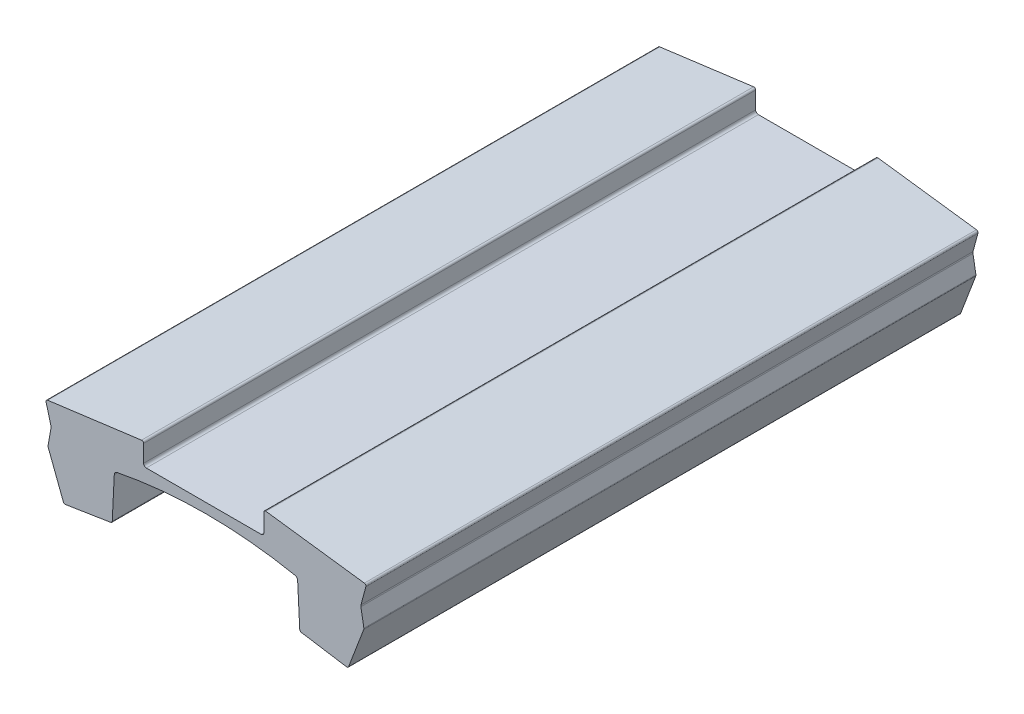
ISO-10303-21;
HEADER;
FILE_DESCRIPTION(('STEP AP214'),'2;1');
FILE_NAME('part.step','',(''),(''),'','','');
FILE_SCHEMA(('AUTOMOTIVE_DESIGN { 1 0 10303 214 1 1 1 1 }'));
ENDSEC;
DATA;
#1=APPLICATION_CONTEXT('core data for automotive mechanical design processes');
#2=APPLICATION_PROTOCOL_DEFINITION('international standard','automotive_design',2000,#1);
#3=PRODUCT_CONTEXT('',#1,'mechanical');
#4=PRODUCT('Part','Part','',(#3));
#5=PRODUCT_RELATED_PRODUCT_CATEGORY('part','',(#4));
#6=PRODUCT_DEFINITION_FORMATION('','',#4);
#7=PRODUCT_DEFINITION_CONTEXT('part definition',#1,'design');
#8=PRODUCT_DEFINITION('design','',#6,#7);
#9=PRODUCT_DEFINITION_SHAPE('','',#8);
#10=(LENGTH_UNIT() NAMED_UNIT(*) SI_UNIT(.MILLI.,.METRE.));
#11=(NAMED_UNIT(*) PLANE_ANGLE_UNIT() SI_UNIT($,.RADIAN.));
#12=(NAMED_UNIT(*) SI_UNIT($,.STERADIAN.) SOLID_ANGLE_UNIT());
#13=UNCERTAINTY_MEASURE_WITH_UNIT(LENGTH_MEASURE(1.E-05),#10,'distance_accuracy_value','');
#14=(GEOMETRIC_REPRESENTATION_CONTEXT(3) GLOBAL_UNCERTAINTY_ASSIGNED_CONTEXT((#13)) GLOBAL_UNIT_ASSIGNED_CONTEXT((#10,
#11,#12)) REPRESENTATION_CONTEXT('',''));
#15=CARTESIAN_POINT('',(0.,0.,0.));
#16=DIRECTION('',(0.,0.,1.));
#17=DIRECTION('',(1.,0.,0.));
#18=AXIS2_PLACEMENT_3D('',#15,#16,#17);
#19=CARTESIAN_POINT('',(-17.4316539331724,90.6078613463852,67.5));
#20=DIRECTION('',(0.,0.,-1.));
#21=DIRECTION('',(-1.,0.,0.));
#22=AXIS2_PLACEMENT_3D('',#19,#20,#21);
#23=CYLINDRICAL_SURFACE('',#22,0.200000000000002);
#24=CARTESIAN_POINT('',(-17.4316539331724,90.6078613463852,0.));
#25=DIRECTION('',(0.,0.,1.));
#26=DIRECTION('',(1.,0.,0.));
#27=AXIS2_PLACEMENT_3D('',#24,#25,#26);
#28=CIRCLE('',#27,0.200000000000002);
#29=CARTESIAN_POINT('',(-17.4577591716164,90.8061503186599,0.));
#30=VERTEX_POINT('',#29);
#31=CARTESIAN_POINT('',(-17.6248390984302,90.5560975373647,0.));
#32=VERTEX_POINT('',#31);
#33=EDGE_CURVE('E288',#30,#32,#28,.T.);
#34=ORIENTED_EDGE('',*,*,#33,.T.);
#35=DIRECTION('',(0.,0.,-1.));
#36=VECTOR('',#35,1.);
#37=CARTESIAN_POINT('',(-17.6248390984302,90.5560975373647,67.5));
#38=LINE('',#37,#36);
#39=CARTESIAN_POINT('',(-17.6248390984302,90.5560975373647,67.5));
#40=VERTEX_POINT('',#39);
#41=EDGE_CURVE('E11',#40,#32,#38,.T.);
#42=ORIENTED_EDGE('',*,*,#41,.F.);
#43=CARTESIAN_POINT('',(-17.4316539331724,90.6078613463852,67.5));
#44=DIRECTION('',(0.,0.,1.));
#45=DIRECTION('',(1.,0.,0.));
#46=AXIS2_PLACEMENT_3D('',#43,#44,#45);
#47=CIRCLE('',#46,0.200000000000002);
#48=CARTESIAN_POINT('',(-17.4577591716164,90.8061503186599,67.5));
#49=VERTEX_POINT('',#48);
#50=EDGE_CURVE('E406',#49,#40,#47,.T.);
#51=ORIENTED_EDGE('',*,*,#50,.F.);
#52=DIRECTION('',(0.,0.,-1.));
#53=VECTOR('',#52,1.);
#54=CARTESIAN_POINT('',(-17.4577591716164,90.8061503186599,67.5));
#55=LINE('',#54,#53);
#56=EDGE_CURVE('E56',#49,#30,#55,.T.);
#57=ORIENTED_EDGE('',*,*,#56,.T.);
#58=EDGE_LOOP('',(#34,#42,#51,#57));
#59=FACE_BOUND('',#58,.T.);
#60=ADVANCED_FACE('F39',(#59),#23,.T.);
#61=CARTESIAN_POINT('',(-17.6248390984302,90.5560975373647,67.5));
#62=DIRECTION('',(0.965925826289071,0.258819045102509,0.));
#63=DIRECTION('',(-0.258819045102509,0.965925826289071,0.));
#64=AXIS2_PLACEMENT_3D('',#61,#62,#63);
#65=PLANE('',#64);
#66=DIRECTION('',(0.258819045102509,-0.965925826289071,0.));
#67=VECTOR('',#66,1.);
#68=CARTESIAN_POINT('',(-17.6248390984302,90.5560975373647,0.));
#69=LINE('',#68,#67);
#70=CARTESIAN_POINT('',(-17.0819649438388,88.5300636103135,0.));
#71=VERTEX_POINT('',#70);
#72=EDGE_CURVE('E291',#32,#71,#69,.T.);
#73=ORIENTED_EDGE('',*,*,#72,.T.);
#74=DIRECTION('',(0.,0.,-1.));
#75=VECTOR('',#74,1.);
#76=CARTESIAN_POINT('',(-17.0819649438388,88.5300636103135,67.5));
#77=LINE('',#76,#75);
#78=CARTESIAN_POINT('',(-17.0819649438388,88.5300636103135,67.5));
#79=VERTEX_POINT('',#78);
#80=EDGE_CURVE('E48',#79,#71,#77,.T.);
#81=ORIENTED_EDGE('',*,*,#80,.F.);
#82=DIRECTION('',(0.258819045102509,-0.965925826289071,0.));
#83=VECTOR('',#82,1.);
#84=CARTESIAN_POINT('',(-17.6248390984302,90.5560975373647,67.5));
#85=LINE('',#84,#83);
#86=EDGE_CURVE('E167',#40,#79,#85,.T.);
#87=ORIENTED_EDGE('',*,*,#86,.F.);
#88=ORIENTED_EDGE('',*,*,#41,.T.);
#89=EDGE_LOOP('',(#73,#81,#87,#88));
#90=FACE_BOUND('',#89,.T.);
#91=ADVANCED_FACE('F626',(#90),#65,.F.);
#92=CARTESIAN_POINT('',(-17.4683352743544,88.4265359922725,67.5));
#93=DIRECTION('',(0.,0.,-1.));
#94=DIRECTION('',(-1.,0.,0.));
#95=AXIS2_PLACEMENT_3D('',#92,#93,#94);
#96=CYLINDRICAL_SURFACE('',#95,0.400000000000002);
#97=CARTESIAN_POINT('',(-17.4683352743544,88.4265359922725,0.));
#98=DIRECTION('',(0.,0.,-1.));
#99=DIRECTION('',(-1.,0.,0.));
#100=AXIS2_PLACEMENT_3D('',#97,#98,#99);
#101=CIRCLE('',#100,0.400000000000002);
#102=CARTESIAN_POINT('',(-17.0743440800539,88.357464009431,0.));
#103=VERTEX_POINT('',#102);
#104=EDGE_CURVE('E294',#71,#103,#101,.T.);
#105=ORIENTED_EDGE('',*,*,#104,.T.);
#106=DIRECTION('',(0.,0.,-1.));
#107=VECTOR('',#106,1.);
#108=CARTESIAN_POINT('',(-17.0743440800539,88.357464009431,67.5));
#109=LINE('',#108,#107);
#110=CARTESIAN_POINT('',(-17.0743440800539,88.357464009431,67.5));
#111=VERTEX_POINT('',#110);
#112=EDGE_CURVE('E493',#111,#103,#109,.T.);
#113=ORIENTED_EDGE('',*,*,#112,.F.);
#114=CARTESIAN_POINT('',(-17.4683352743544,88.4265359922725,67.5));
#115=DIRECTION('',(0.,0.,-1.));
#116=DIRECTION('',(-1.,0.,0.));
#117=AXIS2_PLACEMENT_3D('',#114,#115,#116);
#118=CIRCLE('',#117,0.400000000000002);
#119=EDGE_CURVE('E502',#79,#111,#118,.T.);
#120=ORIENTED_EDGE('',*,*,#119,.F.);
#121=ORIENTED_EDGE('',*,*,#80,.T.);
#122=EDGE_LOOP('',(#105,#113,#120,#121));
#123=FACE_BOUND('',#122,.T.);
#124=ADVANCED_FACE('F500',(#123),#96,.F.);
#125=CARTESIAN_POINT('',(-17.4061010087792,86.4651003738614,67.5));
#126=DIRECTION('',(-0.984977985751272,0.172679957103789,0.));
#127=DIRECTION('',(-0.172679957103789,-0.984977985751272,0.));
#128=AXIS2_PLACEMENT_3D('',#125,#126,#127);
#129=PLANE('',#128);
#130=DIRECTION('',(0.172679957103789,0.984977985751272,0.));
#131=VECTOR('',#130,1.);
#132=CARTESIAN_POINT('',(-17.4061010087792,86.4651003738614,0.));
#133=LINE('',#132,#131);
#134=CARTESIAN_POINT('',(-17.4061010087792,86.4651003738614,0.));
#135=VERTEX_POINT('',#134);
#136=EDGE_CURVE('E298',#135,#103,#133,.T.);
#137=ORIENTED_EDGE('',*,*,#136,.F.);
#138=DIRECTION('',(0.,0.,-1.));
#139=VECTOR('',#138,1.);
#140=CARTESIAN_POINT('',(-17.4061010087792,86.4651003738614,67.5));
#141=LINE('',#140,#139);
#142=CARTESIAN_POINT('',(-17.4061010087792,86.4651003738614,67.5));
#143=VERTEX_POINT('',#142);
#144=EDGE_CURVE('E490',#143,#135,#141,.T.);
#145=ORIENTED_EDGE('',*,*,#144,.F.);
#146=DIRECTION('',(0.172679957103789,0.984977985751272,0.));
#147=VECTOR('',#146,1.);
#148=CARTESIAN_POINT('',(-17.4061010087792,86.4651003738614,67.5));
#149=LINE('',#148,#147);
#150=EDGE_CURVE('E512',#143,#111,#149,.T.);
#151=ORIENTED_EDGE('',*,*,#150,.T.);
#152=ORIENTED_EDGE('',*,*,#112,.T.);
#153=EDGE_LOOP('',(#137,#145,#151,#152));
#154=FACE_BOUND('',#153,.T.);
#155=ADVANCED_FACE('F509',(#154),#129,.T.);
#156=CARTESIAN_POINT('',(-17.209105411629,86.4305643824407,67.5));
#157=DIRECTION('',(0.,0.,-1.));
#158=DIRECTION('',(-1.,0.,0.));
#159=AXIS2_PLACEMENT_3D('',#156,#157,#158);
#160=CYLINDRICAL_SURFACE('',#159,0.200000000000001);
#161=CARTESIAN_POINT('',(-17.209105411629,86.4305643824407,0.));
#162=DIRECTION('',(0.,0.,-1.));
#163=DIRECTION('',(-1.,0.,0.));
#164=AXIS2_PLACEMENT_3D('',#161,#162,#163);
#165=CIRCLE('',#164,0.200000000000001);
#166=CARTESIAN_POINT('',(-17.3959624943184,86.3592591887393,0.));
#167=VERTEX_POINT('',#166);
#168=EDGE_CURVE('E302',#167,#135,#165,.T.);
#169=ORIENTED_EDGE('',*,*,#168,.F.);
#170=DIRECTION('',(0.,0.,-1.));
#171=VECTOR('',#170,1.);
#172=CARTESIAN_POINT('',(-17.3959624943184,86.3592591887393,67.5));
#173=LINE('',#172,#171);
#174=CARTESIAN_POINT('',(-17.3959624943184,86.3592591887393,67.5));
#175=VERTEX_POINT('',#174);
#176=EDGE_CURVE('E487',#175,#167,#173,.T.);
#177=ORIENTED_EDGE('',*,*,#176,.F.);
#178=CARTESIAN_POINT('',(-17.209105411629,86.4305643824407,67.5));
#179=DIRECTION('',(0.,0.,-1.));
#180=DIRECTION('',(-1.,0.,0.));
#181=AXIS2_PLACEMENT_3D('',#178,#179,#180);
#182=CIRCLE('',#181,0.200000000000001);
#183=EDGE_CURVE('E516',#175,#143,#182,.T.);
#184=ORIENTED_EDGE('',*,*,#183,.T.);
#185=ORIENTED_EDGE('',*,*,#144,.T.);
#186=EDGE_LOOP('',(#169,#177,#184,#185));
#187=FACE_BOUND('',#186,.T.);
#188=ADVANCED_FACE('F892',(#187),#160,.T.);
#189=CARTESIAN_POINT('',(-17.3959624943184,86.3592591887393,67.5));
#190=DIRECTION('',(0.934285413447254,0.356525968506776,0.));
#191=DIRECTION('',(-0.356525968506776,0.934285413447254,0.));
#192=AXIS2_PLACEMENT_3D('',#189,#190,#191);
#193=PLANE('',#192);
#194=DIRECTION('',(0.356525968506776,-0.934285413447254,0.));
#195=VECTOR('',#194,1.);
#196=CARTESIAN_POINT('',(-17.3959624943184,86.3592591887393,0.));
#197=LINE('',#196,#195);
#198=CARTESIAN_POINT('',(-15.7145600064224,81.9531009917514,0.));
#199=VERTEX_POINT('',#198);
#200=EDGE_CURVE('E306',#167,#199,#197,.T.);
#201=ORIENTED_EDGE('',*,*,#200,.T.);
#202=DIRECTION('',(0.,0.,-1.));
#203=VECTOR('',#202,1.);
#204=CARTESIAN_POINT('',(-15.7145600064224,81.9531009917514,67.5));
#205=LINE('',#204,#203);
#206=CARTESIAN_POINT('',(-15.7145600064224,81.9531009917514,67.5));
#207=VERTEX_POINT('',#206);
#208=EDGE_CURVE('E483',#207,#199,#205,.T.);
#209=ORIENTED_EDGE('',*,*,#208,.F.);
#210=DIRECTION('',(0.356525968506776,-0.934285413447254,0.));
#211=VECTOR('',#210,1.);
#212=CARTESIAN_POINT('',(-17.3959624943184,86.3592591887393,67.5));
#213=LINE('',#212,#211);
#214=EDGE_CURVE('E520',#175,#207,#213,.T.);
#215=ORIENTED_EDGE('',*,*,#214,.F.);
#216=ORIENTED_EDGE('',*,*,#176,.T.);
#217=EDGE_LOOP('',(#201,#209,#215,#216));
#218=FACE_BOUND('',#217,.T.);
#219=ADVANCED_FACE('F882',(#218),#193,.F.);
#220=CARTESIAN_POINT('',(-15.527702923733,82.0244061854528,67.5));
#221=DIRECTION('',(0.,0.,-1.));
#222=DIRECTION('',(-1.,0.,0.));
#223=AXIS2_PLACEMENT_3D('',#220,#221,#222);
#224=CYLINDRICAL_SURFACE('',#223,0.200000000000001);
#225=CARTESIAN_POINT('',(-15.527702923733,82.0244061854528,0.));
#226=DIRECTION('',(0.,0.,1.));
#227=DIRECTION('',(1.,0.,0.));
#228=AXIS2_PLACEMENT_3D('',#225,#226,#227);
#229=CIRCLE('',#228,0.200000000000001);
#230=CARTESIAN_POINT('',(-15.4964160307249,81.8268685173337,0.));
#231=VERTEX_POINT('',#230);
#232=EDGE_CURVE('E309',#199,#231,#229,.T.);
#233=ORIENTED_EDGE('',*,*,#232,.T.);
#234=DIRECTION('',(0.,0.,-1.));
#235=VECTOR('',#234,1.);
#236=CARTESIAN_POINT('',(-15.4964160307249,81.8268685173337,67.5));
#237=LINE('',#236,#235);
#238=CARTESIAN_POINT('',(-15.4964160307249,81.8268685173337,67.5));
#239=VERTEX_POINT('',#238);
#240=EDGE_CURVE('E479',#239,#231,#237,.T.);
#241=ORIENTED_EDGE('',*,*,#240,.F.);
#242=CARTESIAN_POINT('',(-15.527702923733,82.0244061854528,67.5));
#243=DIRECTION('',(0.,0.,1.));
#244=DIRECTION('',(1.,0.,0.));
#245=AXIS2_PLACEMENT_3D('',#242,#243,#244);
#246=CIRCLE('',#245,0.200000000000001);
#247=EDGE_CURVE('E527',#207,#239,#246,.T.);
#248=ORIENTED_EDGE('',*,*,#247,.F.);
#249=ORIENTED_EDGE('',*,*,#208,.T.);
#250=EDGE_LOOP('',(#233,#241,#248,#249));
#251=FACE_BOUND('',#250,.T.);
#252=ADVANCED_FACE('F872',(#251),#224,.T.);
#253=CARTESIAN_POINT('',(-15.4964160307249,81.8268685173337,67.5));
#254=DIRECTION('',(-0.156434465040214,0.98768834059514,0.));
#255=DIRECTION('',(-0.98768834059514,-0.156434465040214,0.));
#256=AXIS2_PLACEMENT_3D('',#253,#254,#255);
#257=PLANE('',#256);
#258=DIRECTION('',(0.98768834059514,0.156434465040214,0.));
#259=VECTOR('',#258,1.);
#260=CARTESIAN_POINT('',(-15.4964160307249,81.8268685173337,0.));
#261=LINE('',#260,#259);
#262=CARTESIAN_POINT('',(-10.4958388076464,82.6188821421106,0.));
#263=VERTEX_POINT('',#262);
#264=EDGE_CURVE('E312',#231,#263,#261,.T.);
#265=ORIENTED_EDGE('',*,*,#264,.T.);
#266=DIRECTION('',(0.,0.,-1.));
#267=VECTOR('',#266,1.);
#268=CARTESIAN_POINT('',(-10.4958388076464,82.6188821421106,67.5));
#269=LINE('',#268,#267);
#270=CARTESIAN_POINT('',(-10.4958388076464,82.6188821421106,67.5));
#271=VERTEX_POINT('',#270);
#272=EDGE_CURVE('E475',#271,#263,#269,.T.);
#273=ORIENTED_EDGE('',*,*,#272,.F.);
#274=DIRECTION('',(0.98768834059514,0.156434465040214,0.));
#275=VECTOR('',#274,1.);
#276=CARTESIAN_POINT('',(-15.4964160307249,81.8268685173337,67.5));
#277=LINE('',#276,#275);
#278=EDGE_CURVE('E530',#239,#271,#277,.T.);
#279=ORIENTED_EDGE('',*,*,#278,.F.);
#280=ORIENTED_EDGE('',*,*,#240,.T.);
#281=EDGE_LOOP('',(#265,#273,#279,#280));
#282=FACE_BOUND('',#281,.T.);
#283=ADVANCED_FACE('F862',(#282),#257,.F.);
#284=CARTESIAN_POINT('',(-10.5271257006544,82.8164198102296,67.5));
#285=DIRECTION('',(0.,0.,-1.));
#286=DIRECTION('',(-1.,0.,0.));
#287=AXIS2_PLACEMENT_3D('',#284,#285,#286);
#288=CYLINDRICAL_SURFACE('',#287,0.200000000000001);
#289=CARTESIAN_POINT('',(-10.5271257006544,82.8164198102296,0.));
#290=DIRECTION('',(0.,0.,1.));
#291=DIRECTION('',(1.,0.,0.));
#292=AXIS2_PLACEMENT_3D('',#289,#290,#291);
#293=CIRCLE('',#292,0.200000000000001);
#294=CARTESIAN_POINT('',(-10.3273699530985,82.8065384480582,0.));
#295=VERTEX_POINT('',#294);
#296=EDGE_CURVE('E315',#263,#295,#293,.T.);
#297=ORIENTED_EDGE('',*,*,#296,.T.);
#298=DIRECTION('',(0.,0.,-1.));
#299=VECTOR('',#298,1.);
#300=CARTESIAN_POINT('',(-10.3273699530985,82.8065384480582,67.5));
#301=LINE('',#300,#299);
#302=CARTESIAN_POINT('',(-10.3273699530985,82.8065384480582,67.5));
#303=VERTEX_POINT('',#302);
#304=EDGE_CURVE('E471',#303,#295,#301,.T.);
#305=ORIENTED_EDGE('',*,*,#304,.F.);
#306=CARTESIAN_POINT('',(-10.5271257006544,82.8164198102296,67.5));
#307=DIRECTION('',(0.,0.,1.));
#308=DIRECTION('',(1.,0.,0.));
#309=AXIS2_PLACEMENT_3D('',#306,#307,#308);
#310=CIRCLE('',#309,0.200000000000001);
#311=EDGE_CURVE('E533',#271,#303,#310,.T.);
#312=ORIENTED_EDGE('',*,*,#311,.F.);
#313=ORIENTED_EDGE('',*,*,#272,.T.);
#314=EDGE_LOOP('',(#297,#305,#312,#313));
#315=FACE_BOUND('',#314,.T.);
#316=ADVANCED_FACE('F852',(#315),#288,.T.);
#317=CARTESIAN_POINT('',(-10.3273699530985,82.8065384480582,67.5));
#318=DIRECTION('',(-0.998778737779756,0.0494068108571876,0.));
#319=DIRECTION('',(-0.0494068108571876,-0.998778737779756,0.));
#320=AXIS2_PLACEMENT_3D('',#317,#318,#319);
#321=PLANE('',#320);
#322=DIRECTION('',(0.0494068108571876,0.998778737779756,0.));
#323=VECTOR('',#322,1.);
#324=CARTESIAN_POINT('',(-10.3273699530985,82.8065384480582,0.));
#325=LINE('',#324,#323);
#326=CARTESIAN_POINT('',(-10.1018941682697,87.3646229684729,0.));
#327=VERTEX_POINT('',#326);
#328=EDGE_CURVE('E318',#295,#327,#325,.T.);
#329=ORIENTED_EDGE('',*,*,#328,.T.);
#330=DIRECTION('',(0.,0.,-1.));
#331=VECTOR('',#330,1.);
#332=CARTESIAN_POINT('',(-10.1018941682697,87.3646229684729,67.5));
#333=LINE('',#332,#331);
#334=CARTESIAN_POINT('',(-10.1018941682697,87.3646229684729,67.5));
#335=VERTEX_POINT('',#334);
#336=EDGE_CURVE('E468',#335,#327,#333,.T.);
#337=ORIENTED_EDGE('',*,*,#336,.F.);
#338=DIRECTION('',(0.0494068108571876,0.998778737779756,0.));
#339=VECTOR('',#338,1.);
#340=CARTESIAN_POINT('',(-10.3273699530985,82.8065384480582,67.5));
#341=LINE('',#340,#339);
#342=EDGE_CURVE('E536',#303,#335,#341,.T.);
#343=ORIENTED_EDGE('',*,*,#342,.F.);
#344=ORIENTED_EDGE('',*,*,#304,.T.);
#345=EDGE_LOOP('',(#329,#337,#343,#344));
#346=FACE_BOUND('',#345,.T.);
#347=ADVANCED_FACE('F842',(#346),#321,.F.);
#348=CARTESIAN_POINT('',(-9.70238267315777,87.34486024413,67.5));
#349=DIRECTION('',(0.,0.,-1.));
#350=DIRECTION('',(-1.,0.,0.));
#351=AXIS2_PLACEMENT_3D('',#348,#349,#350);
#352=CYLINDRICAL_SURFACE('',#351,0.400000000000001);
#353=CARTESIAN_POINT('',(-9.70238267315777,87.34486024413,0.));
#354=DIRECTION('',(0.,0.,1.));
#355=DIRECTION('',(1.,0.,0.));
#356=AXIS2_PLACEMENT_3D('',#353,#354,#355);
#357=CIRCLE('',#356,0.400000000000001);
#358=CARTESIAN_POINT('',(-9.77976850261417,87.7373031487663,0.));
#359=VERTEX_POINT('',#358);
#360=EDGE_CURVE('E322',#359,#327,#357,.T.);
#361=ORIENTED_EDGE('',*,*,#360,.F.);
#362=DIRECTION('',(0.,0.,-1.));
#363=VECTOR('',#362,1.);
#364=CARTESIAN_POINT('',(-9.77976850261417,87.7373031487663,67.5));
#365=LINE('',#364,#363);
#366=CARTESIAN_POINT('',(-9.77976850261417,87.7373031487663,67.5));
#367=VERTEX_POINT('',#366);
#368=EDGE_CURVE('E465',#367,#359,#365,.T.);
#369=ORIENTED_EDGE('',*,*,#368,.F.);
#370=CARTESIAN_POINT('',(-9.70238267315777,87.34486024413,67.5));
#371=DIRECTION('',(0.,0.,1.));
#372=DIRECTION('',(1.,0.,0.));
#373=AXIS2_PLACEMENT_3D('',#370,#371,#372);
#374=CIRCLE('',#373,0.400000000000001);
#375=EDGE_CURVE('E539',#367,#335,#374,.T.);
#376=ORIENTED_EDGE('',*,*,#375,.T.);
#377=ORIENTED_EDGE('',*,*,#336,.T.);
#378=EDGE_LOOP('',(#361,#369,#376,#377));
#379=FACE_BOUND('',#378,.T.);
#380=ADVANCED_FACE('F832',(#379),#352,.F.);
#381=CARTESIAN_POINT('',(0.00953892362076658,38.0932757122794,67.5));
#382=DIRECTION('',(0.,0.,-1.));
#383=DIRECTION('',(-1.,0.,0.));
#384=AXIS2_PLACEMENT_3D('',#381,#382,#383);
#385=CYLINDRICAL_SURFACE('',#384,50.6);
#386=CARTESIAN_POINT('',(0.00953892362076658,38.0932757122794,0.));
#387=DIRECTION('',(0.,0.,-1.));
#388=DIRECTION('',(-1.,0.,0.));
#389=AXIS2_PLACEMENT_3D('',#386,#387,#388);
#390=CIRCLE('',#389,50.6);
#391=CARTESIAN_POINT('',(9.79907524276584,87.7372580128175,0.));
#392=VERTEX_POINT('',#391);
#393=EDGE_CURVE('E326',#359,#392,#390,.T.);
#394=ORIENTED_EDGE('',*,*,#393,.T.);
#395=DIRECTION('',(0.,0.,-1.));
#396=VECTOR('',#395,1.);
#397=CARTESIAN_POINT('',(9.79907524276584,87.7372580128175,67.5));
#398=LINE('',#397,#396);
#399=CARTESIAN_POINT('',(9.79907524276584,87.7372580128175,67.5));
#400=VERTEX_POINT('',#399);
#401=EDGE_CURVE('E462',#400,#392,#398,.T.);
#402=ORIENTED_EDGE('',*,*,#401,.F.);
#403=CARTESIAN_POINT('',(0.00953892362076658,38.0932757122794,67.5));
#404=DIRECTION('',(0.,0.,-1.));
#405=DIRECTION('',(-1.,0.,0.));
#406=AXIS2_PLACEMENT_3D('',#403,#404,#405);
#407=CIRCLE('',#406,50.6);
#408=EDGE_CURVE('E543',#367,#400,#407,.T.);
#409=ORIENTED_EDGE('',*,*,#408,.F.);
#410=ORIENTED_EDGE('',*,*,#368,.T.);
#411=EDGE_LOOP('',(#394,#402,#409,#410));
#412=FACE_BOUND('',#411,.T.);
#413=ADVANCED_FACE('F822',(#412),#385,.F.);
#414=CARTESIAN_POINT('',(9.72168760387931,87.3448154649871,67.5));
#415=DIRECTION('',(0.,0.,-1.));
#416=DIRECTION('',(-1.,0.,0.));
#417=AXIS2_PLACEMENT_3D('',#414,#415,#416);
#418=CYLINDRICAL_SURFACE('',#417,0.400000000000019);
#419=CARTESIAN_POINT('',(9.72168760387931,87.3448154649871,0.));
#420=DIRECTION('',(0.,0.,1.));
#421=DIRECTION('',(1.,0.,0.));
#422=AXIS2_PLACEMENT_3D('',#419,#420,#421);
#423=CIRCLE('',#422,0.400000000000019);
#424=CARTESIAN_POINT('',(10.1211799293766,87.3649619750771,0.));
#425=VERTEX_POINT('',#424);
#426=EDGE_CURVE('E330',#425,#392,#423,.T.);
#427=ORIENTED_EDGE('',*,*,#426,.F.);
#428=DIRECTION('',(0.,0.,-1.));
#429=VECTOR('',#428,1.);
#430=CARTESIAN_POINT('',(10.1211799293766,87.3649619750771,67.5));
#431=LINE('',#430,#429);
#432=CARTESIAN_POINT('',(10.1211799293766,87.3649619750771,67.5));
#433=VERTEX_POINT('',#432);
#434=EDGE_CURVE('E459',#433,#425,#431,.T.);
#435=ORIENTED_EDGE('',*,*,#434,.F.);
#436=CARTESIAN_POINT('',(9.72168760387931,87.3448154649871,67.5));
#437=DIRECTION('',(0.,0.,1.));
#438=DIRECTION('',(1.,0.,0.));
#439=AXIS2_PLACEMENT_3D('',#436,#437,#438);
#440=CIRCLE('',#439,0.400000000000019);
#441=EDGE_CURVE('E546',#433,#400,#440,.T.);
#442=ORIENTED_EDGE('',*,*,#441,.T.);
#443=ORIENTED_EDGE('',*,*,#401,.T.);
#444=EDGE_LOOP('',(#427,#435,#442,#443));
#445=FACE_BOUND('',#444,.T.);
#446=ADVANCED_FACE('F812',(#445),#418,.F.);
#447=CARTESIAN_POINT('',(10.3511093412533,82.8056097577204,67.5));
#448=DIRECTION('',(-0.998730813743103,-0.0503662752249951,0.));
#449=DIRECTION('',(0.0503662752249951,-0.998730813743103,0.));
#450=AXIS2_PLACEMENT_3D('',#447,#448,#449);
#451=PLANE('',#450);
#452=DIRECTION('',(-0.0503662752249951,0.998730813743103,0.));
#453=VECTOR('',#452,1.);
#454=CARTESIAN_POINT('',(10.3511093412533,82.8056097577204,0.));
#455=LINE('',#454,#453);
#456=CARTESIAN_POINT('',(10.3511093412533,82.8056097577204,0.));
#457=VERTEX_POINT('',#456);
#458=EDGE_CURVE('E334',#457,#425,#455,.T.);
#459=ORIENTED_EDGE('',*,*,#458,.F.);
#460=DIRECTION('',(0.,0.,-1.));
#461=VECTOR('',#460,1.);
#462=CARTESIAN_POINT('',(10.3511093412533,82.8056097577204,67.5));
#463=LINE('',#462,#461);
#464=CARTESIAN_POINT('',(10.3511093412533,82.8056097577204,67.5));
#465=VERTEX_POINT('',#464);
#466=EDGE_CURVE('E456',#465,#457,#463,.T.);
#467=ORIENTED_EDGE('',*,*,#466,.F.);
#468=DIRECTION('',(-0.0503662752249951,0.998730813743103,0.));
#469=VECTOR('',#468,1.);
#470=CARTESIAN_POINT('',(10.3511093412533,82.8056097577204,67.5));
#471=LINE('',#470,#469);
#472=EDGE_CURVE('E550',#465,#433,#471,.T.);
#473=ORIENTED_EDGE('',*,*,#472,.T.);
#474=ORIENTED_EDGE('',*,*,#434,.T.);
#475=EDGE_LOOP('',(#459,#467,#473,#474));
#476=FACE_BOUND('',#475,.T.);
#477=ADVANCED_FACE('F802',(#476),#451,.T.);
#478=CARTESIAN_POINT('',(10.5508555040019,82.8156830127654,67.5));
#479=DIRECTION('',(0.,0.,-1.));
#480=DIRECTION('',(-1.,0.,0.));
#481=AXIS2_PLACEMENT_3D('',#478,#479,#480);
#482=CYLINDRICAL_SURFACE('',#481,0.200000000000001);
#483=CARTESIAN_POINT('',(10.5508555040019,82.8156830127654,0.));
#484=DIRECTION('',(0.,0.,1.));
#485=DIRECTION('',(1.,0.,0.));
#486=AXIS2_PLACEMENT_3D('',#483,#484,#485);
#487=CIRCLE('',#486,0.200000000000001);
#488=CARTESIAN_POINT('',(10.5195686109938,82.6181453446464,0.));
#489=VERTEX_POINT('',#488);
#490=EDGE_CURVE('E338',#457,#489,#487,.T.);
#491=ORIENTED_EDGE('',*,*,#490,.T.);
#492=DIRECTION('',(0.,0.,-1.));
#493=VECTOR('',#492,1.);
#494=CARTESIAN_POINT('',(10.5195686109938,82.6181453446464,67.5));
#495=LINE('',#494,#493);
#496=CARTESIAN_POINT('',(10.5195686109938,82.6181453446464,67.5));
#497=VERTEX_POINT('',#496);
#498=EDGE_CURVE('E453',#497,#489,#495,.T.);
#499=ORIENTED_EDGE('',*,*,#498,.F.);
#500=CARTESIAN_POINT('',(10.5508555040019,82.8156830127654,67.5));
#501=DIRECTION('',(0.,0.,1.));
#502=DIRECTION('',(1.,0.,0.));
#503=AXIS2_PLACEMENT_3D('',#500,#501,#502);
#504=CIRCLE('',#503,0.200000000000001);
#505=EDGE_CURVE('E554',#465,#497,#504,.T.);
#506=ORIENTED_EDGE('',*,*,#505,.F.);
#507=ORIENTED_EDGE('',*,*,#466,.T.);
#508=EDGE_LOOP('',(#491,#499,#506,#507));
#509=FACE_BOUND('',#508,.T.);
#510=ADVANCED_FACE('F792',(#509),#482,.T.);
#511=CARTESIAN_POINT('',(15.5201458340724,81.8261317198694,67.5));
#512=DIRECTION('',(-0.156434465040232,-0.987688340595138,0.));
#513=DIRECTION('',(0.987688340595138,-0.156434465040232,0.));
#514=AXIS2_PLACEMENT_3D('',#511,#512,#513);
#515=PLANE('',#514);
#516=DIRECTION('',(-0.987688340595138,0.156434465040232,0.));
#517=VECTOR('',#516,1.);
#518=CARTESIAN_POINT('',(15.5201458340724,81.8261317198694,0.));
#519=LINE('',#518,#517);
#520=CARTESIAN_POINT('',(15.5201458340724,81.8261317198694,0.));
#521=VERTEX_POINT('',#520);
#522=EDGE_CURVE('E342',#521,#489,#519,.T.);
#523=ORIENTED_EDGE('',*,*,#522,.F.);
#524=DIRECTION('',(0.,0.,-1.));
#525=VECTOR('',#524,1.);
#526=CARTESIAN_POINT('',(15.5201458340724,81.8261317198694,67.5));
#527=LINE('',#526,#525);
#528=CARTESIAN_POINT('',(15.5201458340724,81.8261317198694,67.5));
#529=VERTEX_POINT('',#528);
#530=EDGE_CURVE('E450',#529,#521,#527,.T.);
#531=ORIENTED_EDGE('',*,*,#530,.F.);
#532=DIRECTION('',(-0.987688340595138,0.156434465040232,0.));
#533=VECTOR('',#532,1.);
#534=CARTESIAN_POINT('',(15.5201458340724,81.8261317198694,67.5));
#535=LINE('',#534,#533);
#536=EDGE_CURVE('E557',#529,#497,#535,.T.);
#537=ORIENTED_EDGE('',*,*,#536,.T.);
#538=ORIENTED_EDGE('',*,*,#498,.T.);
#539=EDGE_LOOP('',(#523,#531,#537,#538));
#540=FACE_BOUND('',#539,.T.);
#541=ADVANCED_FACE('F782',(#540),#515,.T.);
#542=CARTESIAN_POINT('',(15.5514327270805,82.0236693879884,67.5));
#543=DIRECTION('',(0.,0.,-1.));
#544=DIRECTION('',(-1.,0.,0.));
#545=AXIS2_PLACEMENT_3D('',#542,#543,#544);
#546=CYLINDRICAL_SURFACE('',#545,0.199999999999996);
#547=CARTESIAN_POINT('',(15.5514327270805,82.0236693879884,0.));
#548=DIRECTION('',(0.,0.,1.));
#549=DIRECTION('',(1.,0.,0.));
#550=AXIS2_PLACEMENT_3D('',#547,#548,#549);
#551=CIRCLE('',#550,0.199999999999996);
#552=CARTESIAN_POINT('',(15.7383582236224,81.9525437333865,0.));
#553=VERTEX_POINT('',#552);
#554=EDGE_CURVE('E346',#521,#553,#551,.T.);
#555=ORIENTED_EDGE('',*,*,#554,.T.);
#556=DIRECTION('',(0.,0.,-1.));
#557=VECTOR('',#556,1.);
#558=CARTESIAN_POINT('',(15.7383582236224,81.9525437333865,67.5));
#559=LINE('',#558,#557);
#560=CARTESIAN_POINT('',(15.7383582236224,81.9525437333865,67.5));
#561=VERTEX_POINT('',#560);
#562=EDGE_CURVE('E447',#561,#553,#559,.T.);
#563=ORIENTED_EDGE('',*,*,#562,.F.);
#564=CARTESIAN_POINT('',(15.5514327270805,82.0236693879884,67.5));
#565=DIRECTION('',(0.,0.,1.));
#566=DIRECTION('',(1.,0.,0.));
#567=AXIS2_PLACEMENT_3D('',#564,#565,#566);
#568=CIRCLE('',#567,0.199999999999996);
#569=EDGE_CURVE('E561',#529,#561,#568,.T.);
#570=ORIENTED_EDGE('',*,*,#569,.F.);
#571=ORIENTED_EDGE('',*,*,#530,.T.);
#572=EDGE_LOOP('',(#555,#563,#570,#571));
#573=FACE_BOUND('',#572,.T.);
#574=ADVANCED_FACE('F772',(#573),#546,.T.);
#575=CARTESIAN_POINT('',(17.4151355267286,86.3592860224749,67.5));
#576=DIRECTION('',(0.934627482709666,-0.355628273009603,0.));
#577=DIRECTION('',(0.355628273009603,0.934627482709666,0.));
#578=AXIS2_PLACEMENT_3D('',#575,#576,#577);
#579=PLANE('',#578);
#580=DIRECTION('',(-0.355628273009603,-0.934627482709666,0.));
#581=VECTOR('',#580,1.);
#582=CARTESIAN_POINT('',(17.4151355267286,86.3592860224749,0.));
#583=LINE('',#582,#581);
#584=CARTESIAN_POINT('',(17.4151355267286,86.3592860224749,0.));
#585=VERTEX_POINT('',#584);
#586=EDGE_CURVE('E350',#585,#553,#583,.T.);
#587=ORIENTED_EDGE('',*,*,#586,.F.);
#588=DIRECTION('',(0.,0.,-1.));
#589=VECTOR('',#588,1.);
#590=CARTESIAN_POINT('',(17.4151355267286,86.3592860224749,67.5));
#591=LINE('',#590,#589);
#592=CARTESIAN_POINT('',(17.4151355267286,86.3592860224749,67.5));
#593=VERTEX_POINT('',#592);
#594=EDGE_CURVE('E444',#593,#585,#591,.T.);
#595=ORIENTED_EDGE('',*,*,#594,.F.);
#596=DIRECTION('',(-0.355628273009603,-0.934627482709666,0.));
#597=VECTOR('',#596,1.);
#598=CARTESIAN_POINT('',(17.4151355267286,86.3592860224749,67.5));
#599=LINE('',#598,#597);
#600=EDGE_CURVE('E564',#593,#561,#599,.T.);
#601=ORIENTED_EDGE('',*,*,#600,.T.);
#602=ORIENTED_EDGE('',*,*,#562,.T.);
#603=EDGE_LOOP('',(#587,#595,#601,#602));
#604=FACE_BOUND('',#603,.T.);
#605=ADVANCED_FACE('F762',(#604),#579,.T.);
#606=CARTESIAN_POINT('',(17.2282100301867,86.4304116770768,67.5));
#607=DIRECTION('',(0.,0.,-1.));
#608=DIRECTION('',(-1.,0.,0.));
#609=AXIS2_PLACEMENT_3D('',#606,#607,#608);
#610=CYLINDRICAL_SURFACE('',#609,0.200000000000004);
#611=CARTESIAN_POINT('',(17.2282100301867,86.4304116770768,0.));
#612=DIRECTION('',(0.,0.,1.));
#613=DIRECTION('',(1.,0.,0.));
#614=AXIS2_PLACEMENT_3D('',#611,#612,#613);
#615=CIRCLE('',#614,0.200000000000004);
#616=CARTESIAN_POINT('',(17.4252056273371,86.4649476684969,0.));
#617=VERTEX_POINT('',#616);
#618=EDGE_CURVE('E354',#585,#617,#615,.T.);
#619=ORIENTED_EDGE('',*,*,#618,.T.);
#620=DIRECTION('',(0.,0.,-1.));
#621=VECTOR('',#620,1.);
#622=CARTESIAN_POINT('',(17.4252056273371,86.4649476684969,67.5));
#623=LINE('',#622,#621);
#624=CARTESIAN_POINT('',(17.4252056273371,86.4649476684969,67.5));
#625=VERTEX_POINT('',#624);
#626=EDGE_CURVE('E441',#625,#617,#623,.T.);
#627=ORIENTED_EDGE('',*,*,#626,.F.);
#628=CARTESIAN_POINT('',(17.2282100301867,86.4304116770768,67.5));
#629=DIRECTION('',(0.,0.,1.));
#630=DIRECTION('',(1.,0.,0.));
#631=AXIS2_PLACEMENT_3D('',#628,#629,#630);
#632=CIRCLE('',#631,0.200000000000004);
#633=EDGE_CURVE('E568',#593,#625,#632,.T.);
#634=ORIENTED_EDGE('',*,*,#633,.F.);
#635=ORIENTED_EDGE('',*,*,#594,.T.);
#636=EDGE_LOOP('',(#619,#627,#634,#635));
#637=FACE_BOUND('',#636,.T.);
#638=ADVANCED_FACE('F752',(#637),#610,.T.);
#639=CARTESIAN_POINT('',(17.0934219273032,88.3574640094302,67.5));
#640=DIRECTION('',(0.984977985751821,0.172679957100658,0.));
#641=DIRECTION('',(-0.172679957100658,0.984977985751821,0.));
#642=AXIS2_PLACEMENT_3D('',#639,#640,#641);
#643=PLANE('',#642);
#644=DIRECTION('',(0.172679957100658,-0.984977985751821,0.));
#645=VECTOR('',#644,1.);
#646=CARTESIAN_POINT('',(17.0934219273032,88.3574640094302,0.));
#647=LINE('',#646,#645);
#648=CARTESIAN_POINT('',(17.0934219273032,88.3574640094302,0.));
#649=VERTEX_POINT('',#648);
#650=EDGE_CURVE('E358',#649,#617,#647,.T.);
#651=ORIENTED_EDGE('',*,*,#650,.F.);
#652=DIRECTION('',(0.,0.,-1.));
#653=VECTOR('',#652,1.);
#654=CARTESIAN_POINT('',(17.0934219273032,88.3574640094302,67.5));
#655=LINE('',#654,#653);
#656=CARTESIAN_POINT('',(17.0934219273032,88.3574640094302,67.5));
#657=VERTEX_POINT('',#656);
#658=EDGE_CURVE('E438',#657,#649,#655,.T.);
#659=ORIENTED_EDGE('',*,*,#658,.F.);
#660=DIRECTION('',(0.172679957100658,-0.984977985751821,0.));
#661=VECTOR('',#660,1.);
#662=CARTESIAN_POINT('',(17.0934219273032,88.3574640094302,67.5));
#663=LINE('',#662,#661);
#664=EDGE_CURVE('E571',#657,#625,#663,.T.);
#665=ORIENTED_EDGE('',*,*,#664,.T.);
#666=ORIENTED_EDGE('',*,*,#626,.T.);
#667=EDGE_LOOP('',(#651,#659,#665,#666));
#668=FACE_BOUND('',#667,.T.);
#669=ADVANCED_FACE('F742',(#668),#643,.T.);
#670=CARTESIAN_POINT('',(17.4874131216039,88.4265359922704,67.5));
#671=DIRECTION('',(0.,0.,-1.));
#672=DIRECTION('',(-1.,0.,0.));
#673=AXIS2_PLACEMENT_3D('',#670,#671,#672);
#674=CYLINDRICAL_SURFACE('',#673,0.400000000000179);
#675=CARTESIAN_POINT('',(17.4874131216039,88.4265359922704,0.));
#676=DIRECTION('',(0.,0.,1.));
#677=DIRECTION('',(1.,0.,0.));
#678=AXIS2_PLACEMENT_3D('',#675,#676,#677);
#679=CIRCLE('',#678,0.400000000000179);
#680=CARTESIAN_POINT('',(17.1010427910881,88.5300636103115,0.));
#681=VERTEX_POINT('',#680);
#682=EDGE_CURVE('E362',#681,#649,#679,.T.);
#683=ORIENTED_EDGE('',*,*,#682,.F.);
#684=DIRECTION('',(0.,0.,-1.));
#685=VECTOR('',#684,1.);
#686=CARTESIAN_POINT('',(17.1010427910881,88.5300636103115,67.5));
#687=LINE('',#686,#685);
#688=CARTESIAN_POINT('',(17.1010427910881,88.5300636103115,67.5));
#689=VERTEX_POINT('',#688);
#690=EDGE_CURVE('E435',#689,#681,#687,.T.);
#691=ORIENTED_EDGE('',*,*,#690,.F.);
#692=CARTESIAN_POINT('',(17.4874131216039,88.4265359922704,67.5));
#693=DIRECTION('',(0.,0.,1.));
#694=DIRECTION('',(1.,0.,0.));
#695=AXIS2_PLACEMENT_3D('',#692,#693,#694);
#696=CIRCLE('',#695,0.400000000000179);
#697=EDGE_CURVE('E575',#689,#657,#696,.T.);
#698=ORIENTED_EDGE('',*,*,#697,.T.);
#699=ORIENTED_EDGE('',*,*,#658,.T.);
#700=EDGE_LOOP('',(#683,#691,#698,#699));
#701=FACE_BOUND('',#700,.T.);
#702=ADVANCED_FACE('F732',(#701),#674,.F.);
#703=CARTESIAN_POINT('',(17.6439169456798,90.5560975373645,67.5));
#704=DIRECTION('',(0.965925826289068,-0.258819045102523,0.));
#705=DIRECTION('',(0.258819045102522,0.965925826289068,0.));
#706=AXIS2_PLACEMENT_3D('',#703,#704,#705);
#707=PLANE('',#706);
#708=DIRECTION('',(-0.258819045102522,-0.965925826289068,0.));
#709=VECTOR('',#708,1.);
#710=CARTESIAN_POINT('',(17.6439169456798,90.5560975373645,0.));
#711=LINE('',#710,#709);
#712=CARTESIAN_POINT('',(17.6439169456798,90.5560975373645,0.));
#713=VERTEX_POINT('',#712);
#714=EDGE_CURVE('E366',#713,#681,#711,.T.);
#715=ORIENTED_EDGE('',*,*,#714,.F.);
#716=DIRECTION('',(0.,0.,-1.));
#717=VECTOR('',#716,1.);
#718=CARTESIAN_POINT('',(17.6439169456798,90.5560975373645,67.5));
#719=LINE('',#718,#717);
#720=CARTESIAN_POINT('',(17.6439169456798,90.5560975373645,67.5));
#721=VERTEX_POINT('',#720);
#722=EDGE_CURVE('E432',#721,#713,#719,.T.);
#723=ORIENTED_EDGE('',*,*,#722,.F.);
#724=DIRECTION('',(-0.258819045102522,-0.965925826289068,0.));
#725=VECTOR('',#724,1.);
#726=CARTESIAN_POINT('',(17.6439169456798,90.5560975373645,67.5));
#727=LINE('',#726,#725);
#728=EDGE_CURVE('E579',#721,#689,#727,.T.);
#729=ORIENTED_EDGE('',*,*,#728,.T.);
#730=ORIENTED_EDGE('',*,*,#690,.T.);
#731=EDGE_LOOP('',(#715,#723,#729,#730));
#732=FACE_BOUND('',#731,.T.);
#733=ADVANCED_FACE('F722',(#732),#707,.T.);
#734=CARTESIAN_POINT('',(17.450731780422,90.607861346385,67.5));
#735=DIRECTION('',(0.,0.,-1.));
#736=DIRECTION('',(-1.,0.,0.));
#737=AXIS2_PLACEMENT_3D('',#734,#735,#736);
#738=CYLINDRICAL_SURFACE('',#737,0.200000000000003);
#739=CARTESIAN_POINT('',(17.450731780422,90.607861346385,0.));
#740=DIRECTION('',(0.,0.,-1.));
#741=DIRECTION('',(-1.,0.,0.));
#742=AXIS2_PLACEMENT_3D('',#739,#740,#741);
#743=CIRCLE('',#742,0.200000000000003);
#744=CARTESIAN_POINT('',(17.4768370188661,90.8061503186598,0.));
#745=VERTEX_POINT('',#744);
#746=EDGE_CURVE('E370',#745,#713,#743,.T.);
#747=ORIENTED_EDGE('',*,*,#746,.F.);
#748=DIRECTION('',(0.,0.,-1.));
#749=VECTOR('',#748,1.);
#750=CARTESIAN_POINT('',(17.4768370188661,90.8061503186598,67.5));
#751=LINE('',#750,#749);
#752=CARTESIAN_POINT('',(17.4768370188661,90.8061503186598,67.5));
#753=VERTEX_POINT('',#752);
#754=EDGE_CURVE('E429',#753,#745,#751,.T.);
#755=ORIENTED_EDGE('',*,*,#754,.F.);
#756=CARTESIAN_POINT('',(17.450731780422,90.607861346385,67.5));
#757=DIRECTION('',(0.,0.,-1.));
#758=DIRECTION('',(-1.,0.,0.));
#759=AXIS2_PLACEMENT_3D('',#756,#757,#758);
#760=CIRCLE('',#759,0.200000000000003);
#761=EDGE_CURVE('E583',#753,#721,#760,.T.);
#762=ORIENTED_EDGE('',*,*,#761,.T.);
#763=ORIENTED_EDGE('',*,*,#722,.T.);
#764=EDGE_LOOP('',(#747,#755,#762,#763));
#765=FACE_BOUND('',#764,.T.);
#766=ADVANCED_FACE('F712',(#765),#738,.T.);
#767=CARTESIAN_POINT('',(6.61564416206828,92.236053485036,67.5));
#768=DIRECTION('',(0.130526192220089,0.991444861373805,0.));
#769=DIRECTION('',(-0.991444861373805,0.130526192220089,0.));
#770=AXIS2_PLACEMENT_3D('',#767,#768,#769);
#771=PLANE('',#770);
#772=DIRECTION('',(0.991444861373805,-0.130526192220089,0.));
#773=VECTOR('',#772,1.);
#774=CARTESIAN_POINT('',(6.61564416206828,92.236053485036,0.));
#775=LINE('',#774,#773);
#776=CARTESIAN_POINT('',(6.61564416206828,92.236053485036,0.));
#777=VERTEX_POINT('',#776);
#778=EDGE_CURVE('E374',#777,#745,#775,.T.);
#779=ORIENTED_EDGE('',*,*,#778,.F.);
#780=DIRECTION('',(0.,0.,-1.));
#781=VECTOR('',#780,1.);
#782=CARTESIAN_POINT('',(6.61564416206828,92.236053485036,67.5));
#783=LINE('',#782,#781);
#784=CARTESIAN_POINT('',(6.61564416206828,92.236053485036,67.5));
#785=VERTEX_POINT('',#784);
#786=EDGE_CURVE('E426',#785,#777,#783,.T.);
#787=ORIENTED_EDGE('',*,*,#786,.F.);
#788=DIRECTION('',(0.991444861373805,-0.130526192220089,0.));
#789=VECTOR('',#788,1.);
#790=CARTESIAN_POINT('',(6.61564416206828,92.236053485036,67.5));
#791=LINE('',#790,#789);
#792=EDGE_CURVE('E587',#785,#753,#791,.T.);
#793=ORIENTED_EDGE('',*,*,#792,.T.);
#794=ORIENTED_EDGE('',*,*,#754,.T.);
#795=EDGE_LOOP('',(#779,#787,#793,#794));
#796=FACE_BOUND('',#795,.T.);
#797=ADVANCED_FACE('F702',(#796),#771,.T.);
#798=CARTESIAN_POINT('',(6.58953892362426,92.0377645127613,67.5));
#799=DIRECTION('',(0.,0.,-1.));
#800=DIRECTION('',(-1.,0.,0.));
#801=AXIS2_PLACEMENT_3D('',#798,#799,#800);
#802=CYLINDRICAL_SURFACE('',#801,0.199999999999996);
#803=CARTESIAN_POINT('',(6.58953892362426,92.0377645127613,0.));
#804=DIRECTION('',(0.,0.,-1.));
#805=DIRECTION('',(-1.,0.,0.));
#806=AXIS2_PLACEMENT_3D('',#803,#804,#805);
#807=CIRCLE('',#806,0.199999999999996);
#808=CARTESIAN_POINT('',(6.38953892362426,92.0377645127613,0.));
#809=VERTEX_POINT('',#808);
#810=EDGE_CURVE('E378',#809,#777,#807,.T.);
#811=ORIENTED_EDGE('',*,*,#810,.F.);
#812=DIRECTION('',(0.,0.,-1.));
#813=VECTOR('',#812,1.);
#814=CARTESIAN_POINT('',(6.38953892362426,92.0377645127613,67.5));
#815=LINE('',#814,#813);
#816=CARTESIAN_POINT('',(6.38953892362426,92.0377645127613,67.5));
#817=VERTEX_POINT('',#816);
#818=EDGE_CURVE('E423',#817,#809,#815,.T.);
#819=ORIENTED_EDGE('',*,*,#818,.F.);
#820=CARTESIAN_POINT('',(6.58953892362426,92.0377645127613,67.5));
#821=DIRECTION('',(0.,0.,-1.));
#822=DIRECTION('',(-1.,0.,0.));
#823=AXIS2_PLACEMENT_3D('',#820,#821,#822);
#824=CIRCLE('',#823,0.199999999999996);
#825=EDGE_CURVE('E591',#817,#785,#824,.T.);
#826=ORIENTED_EDGE('',*,*,#825,.T.);
#827=ORIENTED_EDGE('',*,*,#786,.T.);
#828=EDGE_LOOP('',(#811,#819,#826,#827));
#829=FACE_BOUND('',#828,.T.);
#830=ADVANCED_FACE('F692',(#829),#802,.T.);
#831=CARTESIAN_POINT('',(6.38953892362426,92.0377645127613,67.5));
#832=DIRECTION('',(1.,0.,0.));
#833=DIRECTION('',(0.,1.,0.));
#834=AXIS2_PLACEMENT_3D('',#831,#832,#833);
#835=PLANE('',#834);
#836=DIRECTION('',(0.,-1.,0.));
#837=VECTOR('',#836,1.);
#838=CARTESIAN_POINT('',(6.38953892362426,92.0377645127613,0.));
#839=LINE('',#838,#837);
#840=CARTESIAN_POINT('',(6.38953892362426,90.073906140006,0.));
#841=VERTEX_POINT('',#840);
#842=EDGE_CURVE('E382',#809,#841,#839,.T.);
#843=ORIENTED_EDGE('',*,*,#842,.T.);
#844=DIRECTION('',(0.,0.,-1.));
#845=VECTOR('',#844,1.);
#846=CARTESIAN_POINT('',(6.38953892362426,90.073906140006,67.5));
#847=LINE('',#846,#845);
#848=CARTESIAN_POINT('',(6.38953892362426,90.073906140006,67.5));
#849=VERTEX_POINT('',#848);
#850=EDGE_CURVE('E419',#849,#841,#847,.T.);
#851=ORIENTED_EDGE('',*,*,#850,.F.);
#852=DIRECTION('',(0.,-1.,0.));
#853=VECTOR('',#852,1.);
#854=CARTESIAN_POINT('',(6.38953892362426,92.0377645127613,67.5));
#855=LINE('',#854,#853);
#856=EDGE_CURVE('E595',#817,#849,#855,.T.);
#857=ORIENTED_EDGE('',*,*,#856,.F.);
#858=ORIENTED_EDGE('',*,*,#818,.T.);
#859=EDGE_LOOP('',(#843,#851,#857,#858));
#860=FACE_BOUND('',#859,.T.);
#861=ADVANCED_FACE('F683',(#860),#835,.F.);
#862=CARTESIAN_POINT('',(6.08953892362426,90.073906140006,67.5));
#863=DIRECTION('',(0.,0.,-1.));
#864=DIRECTION('',(-1.,0.,0.));
#865=AXIS2_PLACEMENT_3D('',#862,#863,#864);
#866=CYLINDRICAL_SURFACE('',#865,0.299999999999997);
#867=CARTESIAN_POINT('',(6.08953892362426,90.073906140006,0.));
#868=DIRECTION('',(0.,0.,-1.));
#869=DIRECTION('',(-1.,0.,0.));
#870=AXIS2_PLACEMENT_3D('',#867,#868,#869);
#871=CIRCLE('',#870,0.299999999999997);
#872=CARTESIAN_POINT('',(6.08953892362426,89.773906140006,0.));
#873=VERTEX_POINT('',#872);
#874=EDGE_CURVE('E385',#841,#873,#871,.T.);
#875=ORIENTED_EDGE('',*,*,#874,.T.);
#876=DIRECTION('',(0.,0.,-1.));
#877=VECTOR('',#876,1.);
#878=CARTESIAN_POINT('',(6.08953892362426,89.773906140006,67.5));
#879=LINE('',#878,#877);
#880=CARTESIAN_POINT('',(6.08953892362426,89.773906140006,67.5));
#881=VERTEX_POINT('',#880);
#882=EDGE_CURVE('E416',#881,#873,#879,.T.);
#883=ORIENTED_EDGE('',*,*,#882,.F.);
#884=CARTESIAN_POINT('',(6.08953892362426,90.073906140006,67.5));
#885=DIRECTION('',(0.,0.,-1.));
#886=DIRECTION('',(-1.,0.,0.));
#887=AXIS2_PLACEMENT_3D('',#884,#885,#886);
#888=CIRCLE('',#887,0.299999999999997);
#889=EDGE_CURVE('E598',#849,#881,#888,.T.);
#890=ORIENTED_EDGE('',*,*,#889,.F.);
#891=ORIENTED_EDGE('',*,*,#850,.T.);
#892=EDGE_LOOP('',(#875,#883,#890,#891));
#893=FACE_BOUND('',#892,.T.);
#894=ADVANCED_FACE('F611',(#893),#866,.F.);
#895=CARTESIAN_POINT('',(-6.57046107637574,89.773906140006,67.5));
#896=DIRECTION('',(0.,1.,0.));
#897=DIRECTION('',(0.,0.,1.));
#898=AXIS2_PLACEMENT_3D('',#895,#896,#897);
#899=PLANE('',#898);
#900=DIRECTION('',(1.,0.,0.));
#901=VECTOR('',#900,1.);
#902=CARTESIAN_POINT('',(-6.57046107637574,89.773906140006,0.));
#903=LINE('',#902,#901);
#904=CARTESIAN_POINT('',(-6.57046107637574,89.773906140006,0.));
#905=VERTEX_POINT('',#904);
#906=EDGE_CURVE('E389',#905,#873,#903,.T.);
#907=ORIENTED_EDGE('',*,*,#906,.F.);
#908=DIRECTION('',(0.,0.,-1.));
#909=VECTOR('',#908,1.);
#910=CARTESIAN_POINT('',(-6.57046107637574,89.773906140006,67.5));
#911=LINE('',#910,#909);
#912=CARTESIAN_POINT('',(-6.57046107637574,89.773906140006,67.5));
#913=VERTEX_POINT('',#912);
#914=EDGE_CURVE('E413',#913,#905,#911,.T.);
#915=ORIENTED_EDGE('',*,*,#914,.F.);
#916=DIRECTION('',(1.,0.,0.));
#917=VECTOR('',#916,1.);
#918=CARTESIAN_POINT('',(-6.57046107637574,89.773906140006,67.5));
#919=LINE('',#918,#917);
#920=EDGE_CURVE('E282',#913,#881,#919,.T.);
#921=ORIENTED_EDGE('',*,*,#920,.T.);
#922=ORIENTED_EDGE('',*,*,#882,.T.);
#923=EDGE_LOOP('',(#907,#915,#921,#922));
#924=FACE_BOUND('',#923,.T.);
#925=ADVANCED_FACE('F604',(#924),#899,.T.);
#926=CARTESIAN_POINT('',(-6.57046107637574,90.073906140006,67.5));
#927=DIRECTION('',(0.,0.,-1.));
#928=DIRECTION('',(-1.,0.,0.));
#929=AXIS2_PLACEMENT_3D('',#926,#927,#928);
#930=CYLINDRICAL_SURFACE('',#929,0.299999999999997);
#931=CARTESIAN_POINT('',(-6.57046107637574,90.073906140006,0.));
#932=DIRECTION('',(0.,0.,-1.));
#933=DIRECTION('',(-1.,0.,0.));
#934=AXIS2_PLACEMENT_3D('',#931,#932,#933);
#935=CIRCLE('',#934,0.299999999999997);
#936=CARTESIAN_POINT('',(-6.87046107637574,90.073906140006,0.));
#937=VERTEX_POINT('',#936);
#938=EDGE_CURVE('E393',#905,#937,#935,.T.);
#939=ORIENTED_EDGE('',*,*,#938,.T.);
#940=DIRECTION('',(0.,0.,-1.));
#941=VECTOR('',#940,1.);
#942=CARTESIAN_POINT('',(-6.87046107637574,90.073906140006,67.5));
#943=LINE('',#942,#941);
#944=CARTESIAN_POINT('',(-6.87046107637574,90.073906140006,67.5));
#945=VERTEX_POINT('',#944);
#946=EDGE_CURVE('E265',#945,#937,#943,.T.);
#947=ORIENTED_EDGE('',*,*,#946,.F.);
#948=CARTESIAN_POINT('',(-6.57046107637574,90.073906140006,67.5));
#949=DIRECTION('',(0.,0.,-1.));
#950=DIRECTION('',(-1.,0.,0.));
#951=AXIS2_PLACEMENT_3D('',#948,#949,#950);
#952=CIRCLE('',#951,0.299999999999997);
#953=EDGE_CURVE('E277',#913,#945,#952,.T.);
#954=ORIENTED_EDGE('',*,*,#953,.F.);
#955=ORIENTED_EDGE('',*,*,#914,.T.);
#956=EDGE_LOOP('',(#939,#947,#954,#955));
#957=FACE_BOUND('',#956,.T.);
#958=ADVANCED_FACE('F616',(#957),#930,.F.);
#959=CARTESIAN_POINT('',(-6.87046107637574,91.9719382639667,67.5));
#960=DIRECTION('',(1.,0.,0.));
#961=DIRECTION('',(0.,0.,-1.));
#962=AXIS2_PLACEMENT_3D('',#959,#960,#961);
#963=PLANE('',#962);
#964=DIRECTION('',(0.,-1.,0.));
#965=VECTOR('',#964,1.);
#966=CARTESIAN_POINT('',(-6.87046107637574,91.9719382639667,0.));
#967=LINE('',#966,#965);
#968=CARTESIAN_POINT('',(-6.87046107637574,91.9719382639667,0.));
#969=VERTEX_POINT('',#968);
#970=EDGE_CURVE('E261',#969,#937,#967,.T.);
#971=ORIENTED_EDGE('',*,*,#970,.F.);
#972=DIRECTION('',(0.,0.,-1.));
#973=VECTOR('',#972,1.);
#974=CARTESIAN_POINT('',(-6.87046107637574,91.9719382639667,67.5));
#975=LINE('',#974,#973);
#976=CARTESIAN_POINT('',(-6.87046107637574,91.9719382639667,67.5));
#977=VERTEX_POINT('',#976);
#978=EDGE_CURVE('E255',#977,#969,#975,.T.);
#979=ORIENTED_EDGE('',*,*,#978,.F.);
#980=DIRECTION('',(0.,-1.,0.));
#981=VECTOR('',#980,1.);
#982=CARTESIAN_POINT('',(-6.87046107637574,91.9719382639667,67.5));
#983=LINE('',#982,#981);
#984=EDGE_CURVE('E259',#977,#945,#983,.T.);
#985=ORIENTED_EDGE('',*,*,#984,.T.);
#986=ORIENTED_EDGE('',*,*,#946,.T.);
#987=EDGE_LOOP('',(#971,#979,#985,#986));
#988=FACE_BOUND('',#987,.T.);
#989=ADVANCED_FACE('F257',(#988),#963,.T.);
#990=CARTESIAN_POINT('',(-7.07046107637574,91.9719382639667,67.5));
#991=DIRECTION('',(0.,0.,-1.));
#992=DIRECTION('',(-1.,0.,0.));
#993=AXIS2_PLACEMENT_3D('',#990,#991,#992);
#994=CYLINDRICAL_SURFACE('',#993,0.200000000000001);
#995=CARTESIAN_POINT('',(-7.07046107637574,91.9719382639667,0.));
#996=DIRECTION('',(0.,0.,1.));
#997=DIRECTION('',(1.,0.,0.));
#998=AXIS2_PLACEMENT_3D('',#995,#996,#997);
#999=CIRCLE('',#998,0.200000000000001);
#1000=CARTESIAN_POINT('',(-7.09656631481975,92.1702272362414,0.));
#1001=VERTEX_POINT('',#1000);
#1002=EDGE_CURVE('E399',#969,#1001,#999,.T.);
#1003=ORIENTED_EDGE('',*,*,#1002,.T.);
#1004=DIRECTION('',(0.,0.,-1.));
#1005=VECTOR('',#1004,1.);
#1006=CARTESIAN_POINT('',(-7.09656631481975,92.1702272362414,67.5));
#1007=LINE('',#1006,#1005);
#1008=CARTESIAN_POINT('',(-7.09656631481975,92.1702272362414,67.5));
#1009=VERTEX_POINT('',#1008);
#1010=EDGE_CURVE('E155',#1009,#1001,#1007,.T.);
#1011=ORIENTED_EDGE('',*,*,#1010,.F.);
#1012=CARTESIAN_POINT('',(-7.07046107637574,91.9719382639667,67.5));
#1013=DIRECTION('',(0.,0.,1.));
#1014=DIRECTION('',(1.,0.,0.));
#1015=AXIS2_PLACEMENT_3D('',#1012,#1013,#1014);
#1016=CIRCLE('',#1015,0.200000000000001);
#1017=EDGE_CURVE('E267',#977,#1009,#1016,.T.);
#1018=ORIENTED_EDGE('',*,*,#1017,.F.);
#1019=ORIENTED_EDGE('',*,*,#978,.T.);
#1020=EDGE_LOOP('',(#1003,#1011,#1018,#1019));
#1021=FACE_BOUND('',#1020,.T.);
#1022=ADVANCED_FACE('F268',(#1021),#994,.T.);
#1023=CARTESIAN_POINT('',(-17.4577591716164,90.8061503186599,67.5));
#1024=DIRECTION('',(-0.130526192220009,0.991444861373816,0.));
#1025=DIRECTION('',(-0.991444861373816,-0.130526192220009,0.));
#1026=AXIS2_PLACEMENT_3D('',#1023,#1024,#1025);
#1027=PLANE('',#1026);
#1028=DIRECTION('',(0.991444861373816,0.130526192220009,0.));
#1029=VECTOR('',#1028,1.);
#1030=CARTESIAN_POINT('',(-17.4577591716164,90.8061503186599,0.));
#1031=LINE('',#1030,#1029);
#1032=EDGE_CURVE('E402',#30,#1001,#1031,.T.);
#1033=ORIENTED_EDGE('',*,*,#1032,.F.);
#1034=ORIENTED_EDGE('',*,*,#56,.F.);
#1035=DIRECTION('',(0.991444861373816,0.130526192220009,0.));
#1036=VECTOR('',#1035,1.);
#1037=CARTESIAN_POINT('',(-17.4577591716164,90.8061503186599,67.5));
#1038=LINE('',#1037,#1036);
#1039=EDGE_CURVE('E272',#49,#1009,#1038,.T.);
#1040=ORIENTED_EDGE('',*,*,#1039,.T.);
#1041=ORIENTED_EDGE('',*,*,#1010,.T.);
#1042=EDGE_LOOP('',(#1033,#1034,#1040,#1041));
#1043=FACE_BOUND('',#1042,.T.);
#1044=ADVANCED_FACE('F631',(#1043),#1027,.T.);
#1045=CARTESIAN_POINT('',(-17.4316539331724,90.6078613463852,67.5));
#1046=DIRECTION('',(0.,0.,1.));
#1047=DIRECTION('',(1.,0.,0.));
#1048=AXIS2_PLACEMENT_3D('',#1045,#1046,#1047);
#1049=PLANE('',#1048);
#1050=ORIENTED_EDGE('',*,*,#50,.T.);
#1051=ORIENTED_EDGE('',*,*,#86,.T.);
#1052=ORIENTED_EDGE('',*,*,#119,.T.);
#1053=ORIENTED_EDGE('',*,*,#150,.F.);
#1054=ORIENTED_EDGE('',*,*,#183,.F.);
#1055=ORIENTED_EDGE('',*,*,#214,.T.);
#1056=ORIENTED_EDGE('',*,*,#247,.T.);
#1057=ORIENTED_EDGE('',*,*,#278,.T.);
#1058=ORIENTED_EDGE('',*,*,#311,.T.);
#1059=ORIENTED_EDGE('',*,*,#342,.T.);
#1060=ORIENTED_EDGE('',*,*,#375,.F.);
#1061=ORIENTED_EDGE('',*,*,#408,.T.);
#1062=ORIENTED_EDGE('',*,*,#441,.F.);
#1063=ORIENTED_EDGE('',*,*,#472,.F.);
#1064=ORIENTED_EDGE('',*,*,#505,.T.);
#1065=ORIENTED_EDGE('',*,*,#536,.F.);
#1066=ORIENTED_EDGE('',*,*,#569,.T.);
#1067=ORIENTED_EDGE('',*,*,#600,.F.);
#1068=ORIENTED_EDGE('',*,*,#633,.T.);
#1069=ORIENTED_EDGE('',*,*,#664,.F.);
#1070=ORIENTED_EDGE('',*,*,#697,.F.);
#1071=ORIENTED_EDGE('',*,*,#728,.F.);
#1072=ORIENTED_EDGE('',*,*,#761,.F.);
#1073=ORIENTED_EDGE('',*,*,#792,.F.);
#1074=ORIENTED_EDGE('',*,*,#825,.F.);
#1075=ORIENTED_EDGE('',*,*,#856,.T.);
#1076=ORIENTED_EDGE('',*,*,#889,.T.);
#1077=ORIENTED_EDGE('',*,*,#920,.F.);
#1078=ORIENTED_EDGE('',*,*,#953,.T.);
#1079=ORIENTED_EDGE('',*,*,#984,.F.);
#1080=ORIENTED_EDGE('',*,*,#1017,.T.);
#1081=ORIENTED_EDGE('',*,*,#1039,.F.);
#1082=EDGE_LOOP('',(#1050,#1051,#1052,#1053,#1054,#1055,#1056,#1057,#1058,#1059,#1060,#1061,
#1062,#1063,#1064,#1065,#1066,#1067,#1068,#1069,#1070,#1071,#1072,#1073,#1074,#1075,#1076,#1077,
#1078,#1079,#1080,#1081));
#1083=FACE_BOUND('',#1082,.T.);
#1084=ADVANCED_FACE('F274',(#1083),#1049,.T.);
#1085=CARTESIAN_POINT('',(-17.4316539331724,90.6078613463852,0.));
#1086=DIRECTION('',(0.,0.,1.));
#1087=DIRECTION('',(1.,0.,0.));
#1088=AXIS2_PLACEMENT_3D('',#1085,#1086,#1087);
#1089=PLANE('',#1088);
#1090=ORIENTED_EDGE('',*,*,#33,.F.);
#1091=ORIENTED_EDGE('',*,*,#1032,.T.);
#1092=ORIENTED_EDGE('',*,*,#1002,.F.);
#1093=ORIENTED_EDGE('',*,*,#970,.T.);
#1094=ORIENTED_EDGE('',*,*,#938,.F.);
#1095=ORIENTED_EDGE('',*,*,#906,.T.);
#1096=ORIENTED_EDGE('',*,*,#874,.F.);
#1097=ORIENTED_EDGE('',*,*,#842,.F.);
#1098=ORIENTED_EDGE('',*,*,#810,.T.);
#1099=ORIENTED_EDGE('',*,*,#778,.T.);
#1100=ORIENTED_EDGE('',*,*,#746,.T.);
#1101=ORIENTED_EDGE('',*,*,#714,.T.);
#1102=ORIENTED_EDGE('',*,*,#682,.T.);
#1103=ORIENTED_EDGE('',*,*,#650,.T.);
#1104=ORIENTED_EDGE('',*,*,#618,.F.);
#1105=ORIENTED_EDGE('',*,*,#586,.T.);
#1106=ORIENTED_EDGE('',*,*,#554,.F.);
#1107=ORIENTED_EDGE('',*,*,#522,.T.);
#1108=ORIENTED_EDGE('',*,*,#490,.F.);
#1109=ORIENTED_EDGE('',*,*,#458,.T.);
#1110=ORIENTED_EDGE('',*,*,#426,.T.);
#1111=ORIENTED_EDGE('',*,*,#393,.F.);
#1112=ORIENTED_EDGE('',*,*,#360,.T.);
#1113=ORIENTED_EDGE('',*,*,#328,.F.);
#1114=ORIENTED_EDGE('',*,*,#296,.F.);
#1115=ORIENTED_EDGE('',*,*,#264,.F.);
#1116=ORIENTED_EDGE('',*,*,#232,.F.);
#1117=ORIENTED_EDGE('',*,*,#200,.F.);
#1118=ORIENTED_EDGE('',*,*,#168,.T.);
#1119=ORIENTED_EDGE('',*,*,#136,.T.);
#1120=ORIENTED_EDGE('',*,*,#104,.F.);
#1121=ORIENTED_EDGE('',*,*,#72,.F.);
#1122=EDGE_LOOP('',(#1090,#1091,#1092,#1093,#1094,#1095,#1096,#1097,#1098,#1099,#1100,#1101,
#1102,#1103,#1104,#1105,#1106,#1107,#1108,#1109,#1110,#1111,#1112,#1113,#1114,#1115,#1116,#1117,
#1118,#1119,#1120,#1121));
#1123=FACE_BOUND('',#1122,.T.);
#1124=ADVANCED_FACE('F504',(#1123),#1089,.F.);
#1125=CLOSED_SHELL('',(#60,#91,#124,#155,#188,#219,#252,#283,#316,#347,#380,#413,#446,#477,#510,
#541,#574,#605,#638,#669,#702,#733,#766,#797,#830,#861,#894,#925,#958,#989,#1022,#1044,#1084,#1124));
#1126=MANIFOLD_SOLID_BREP('B2',#1125);
#1127=ADVANCED_BREP_SHAPE_REPRESENTATION('',(#18,#1126),#14);
#1128=SHAPE_DEFINITION_REPRESENTATION(#9,#1127);
ENDSEC;
END-ISO-10303-21;
